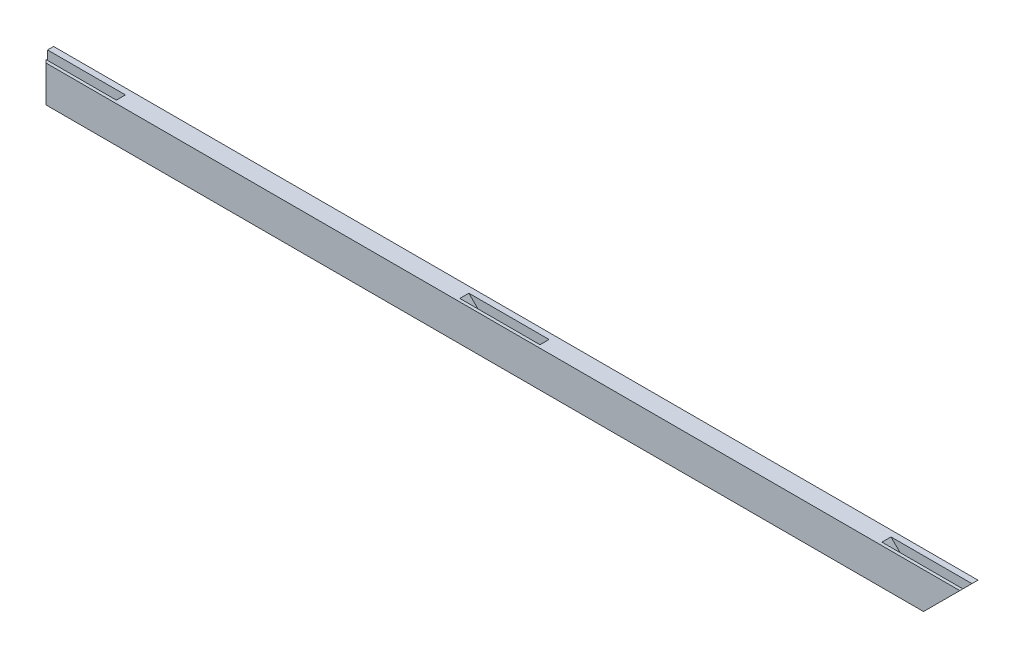
ISO-10303-21;
HEADER;
FILE_DESCRIPTION(('STEP AP214'),'2;1');
FILE_NAME('part.step','',(''),(''),'','','');
FILE_SCHEMA(('AUTOMOTIVE_DESIGN { 1 0 10303 214 1 1 1 1 }'));
ENDSEC;
DATA;
#1=APPLICATION_CONTEXT('core data for automotive mechanical design processes');
#2=APPLICATION_PROTOCOL_DEFINITION('international standard','automotive_design',2000,#1);
#3=PRODUCT_CONTEXT('',#1,'mechanical');
#4=PRODUCT('Part','Part','',(#3));
#5=PRODUCT_RELATED_PRODUCT_CATEGORY('part','',(#4));
#6=PRODUCT_DEFINITION_FORMATION('','',#4);
#7=PRODUCT_DEFINITION_CONTEXT('part definition',#1,'design');
#8=PRODUCT_DEFINITION('design','',#6,#7);
#9=PRODUCT_DEFINITION_SHAPE('','',#8);
#10=(LENGTH_UNIT() NAMED_UNIT(*) SI_UNIT(.MILLI.,.METRE.));
#11=(NAMED_UNIT(*) PLANE_ANGLE_UNIT() SI_UNIT($,.RADIAN.));
#12=(NAMED_UNIT(*) SI_UNIT($,.STERADIAN.) SOLID_ANGLE_UNIT());
#13=UNCERTAINTY_MEASURE_WITH_UNIT(LENGTH_MEASURE(1.E-05),#10,'distance_accuracy_value','');
#14=(GEOMETRIC_REPRESENTATION_CONTEXT(3) GLOBAL_UNCERTAINTY_ASSIGNED_CONTEXT((#13)) GLOBAL_UNIT_ASSIGNED_CONTEXT((#10,
#11,#12)) REPRESENTATION_CONTEXT('',''));
#15=CARTESIAN_POINT('',(0.,0.,0.));
#16=DIRECTION('',(0.,0.,1.));
#17=DIRECTION('',(1.,0.,0.));
#18=AXIS2_PLACEMENT_3D('',#15,#16,#17);
#19=CARTESIAN_POINT('',(611.,12.0000000000005,12.));
#20=DIRECTION('',(0.,-1.,0.));
#21=DIRECTION('',(1.,0.,0.));
#22=AXIS2_PLACEMENT_3D('',#19,#20,#21);
#23=PLANE('',#22);
#24=DIRECTION('',(-1.,0.,0.));
#25=VECTOR('',#24,1.);
#26=CARTESIAN_POINT('',(331.5,12.0000000000005,4.));
#27=LINE('',#26,#25);
#28=CARTESIAN_POINT('',(331.5,12.0000000000005,4.));
#29=VERTEX_POINT('',#28);
#30=CARTESIAN_POINT('',(278.5,12.0000000000005,4.));
#31=VERTEX_POINT('',#30);
#32=EDGE_CURVE('E422',#29,#31,#27,.T.);
#33=ORIENTED_EDGE('',*,*,#32,.F.);
#34=DIRECTION('',(0.,0.,1.));
#35=VECTOR('',#34,1.);
#36=CARTESIAN_POINT('',(331.5,12.0000000000005,4.));
#37=LINE('',#36,#35);
#38=CARTESIAN_POINT('',(331.5,12.0000000000005,10.));
#39=VERTEX_POINT('',#38);
#40=EDGE_CURVE('E454',#29,#39,#37,.T.);
#41=ORIENTED_EDGE('',*,*,#40,.T.);
#42=DIRECTION('',(-1.,0.,0.));
#43=VECTOR('',#42,1.);
#44=CARTESIAN_POINT('',(331.5,12.0000000000005,10.));
#45=LINE('',#44,#43);
#46=CARTESIAN_POINT('',(278.5,12.0000000000003,10.));
#47=VERTEX_POINT('',#46);
#48=EDGE_CURVE('E411',#39,#47,#45,.T.);
#49=ORIENTED_EDGE('',*,*,#48,.T.);
#50=DIRECTION('',(0.,0.,1.));
#51=VECTOR('',#50,1.);
#52=CARTESIAN_POINT('',(278.5,12.0000000000005,4.));
#53=LINE('',#52,#51);
#54=EDGE_CURVE('E439',#31,#47,#53,.T.);
#55=ORIENTED_EDGE('',*,*,#54,.F.);
#56=EDGE_LOOP('',(#33,#41,#49,#55));
#57=FACE_BOUND('',#56,.T.);
#58=DIRECTION('',(-1.,0.,0.));
#59=VECTOR('',#58,1.);
#60=CARTESIAN_POINT('',(51.5,12.0000000000005,4.));
#61=LINE('',#60,#59);
#62=CARTESIAN_POINT('',(51.5,12.0000000000005,4.));
#63=VERTEX_POINT('',#62);
#64=CARTESIAN_POINT('',(0.,12.0000000000001,4.));
#65=VERTEX_POINT('',#64);
#66=EDGE_CURVE('E272',#63,#65,#61,.T.);
#67=ORIENTED_EDGE('',*,*,#66,.F.);
#68=DIRECTION('',(0.,0.,1.));
#69=VECTOR('',#68,1.);
#70=CARTESIAN_POINT('',(51.5,12.0000000000005,4.));
#71=LINE('',#70,#69);
#72=CARTESIAN_POINT('',(51.5,12.0000000000005,10.));
#73=VERTEX_POINT('',#72);
#74=EDGE_CURVE('E283',#63,#73,#71,.T.);
#75=ORIENTED_EDGE('',*,*,#74,.T.);
#76=DIRECTION('',(-1.,0.,0.));
#77=VECTOR('',#76,1.);
#78=CARTESIAN_POINT('',(51.5,12.0000000000005,10.));
#79=LINE('',#78,#77);
#80=CARTESIAN_POINT('',(5.00000000000007,12.0000000000002,10.));
#81=VERTEX_POINT('',#80);
#82=EDGE_CURVE('E288',#73,#81,#79,.T.);
#83=ORIENTED_EDGE('',*,*,#82,.T.);
#84=DIRECTION('',(0.707106781186548,0.,0.707106781186548));
#85=VECTOR('',#84,1.);
#86=CARTESIAN_POINT('',(7.00000000000006,12.0000000000002,12.));
#87=LINE('',#86,#85);
#88=CARTESIAN_POINT('',(7.00000000000012,12.0000000000002,12.));
#89=VERTEX_POINT('',#88);
#90=EDGE_CURVE('E520',#81,#89,#87,.T.);
#91=ORIENTED_EDGE('',*,*,#90,.T.);
#92=DIRECTION('',(-1.,0.,0.));
#93=VECTOR('',#92,1.);
#94=CARTESIAN_POINT('',(611.,12.0000000000005,12.));
#95=LINE('',#94,#93);
#96=CARTESIAN_POINT('',(611.,12.0000000000005,12.));
#97=VERTEX_POINT('',#96);
#98=EDGE_CURVE('E468',#97,#89,#95,.T.);
#99=ORIENTED_EDGE('',*,*,#98,.F.);
#100=DIRECTION('',(0.,0.,-1.));
#101=VECTOR('',#100,1.);
#102=CARTESIAN_POINT('',(611.,12.0000000000005,12.));
#103=LINE('',#102,#101);
#104=CARTESIAN_POINT('',(611.,12.0000000000005,10.));
#105=VERTEX_POINT('',#104);
#106=EDGE_CURVE('E494',#97,#105,#103,.T.);
#107=ORIENTED_EDGE('',*,*,#106,.T.);
#108=DIRECTION('',(-1.,0.,0.));
#109=VECTOR('',#108,1.);
#110=CARTESIAN_POINT('',(557.5,12.0000000000005,10.));
#111=LINE('',#110,#109);
#112=CARTESIAN_POINT('',(557.5,12.0000000000005,10.));
#113=VERTEX_POINT('',#112);
#114=EDGE_CURVE('E63',#105,#113,#111,.T.);
#115=ORIENTED_EDGE('',*,*,#114,.T.);
#116=DIRECTION('',(0.,0.,1.));
#117=VECTOR('',#116,1.);
#118=CARTESIAN_POINT('',(557.5,12.0000000000005,4.));
#119=LINE('',#118,#117);
#120=CARTESIAN_POINT('',(557.5,12.0000000000005,4.));
#121=VERTEX_POINT('',#120);
#122=EDGE_CURVE('E237',#121,#113,#119,.T.);
#123=ORIENTED_EDGE('',*,*,#122,.F.);
#124=DIRECTION('',(-1.,0.,0.));
#125=VECTOR('',#124,1.);
#126=CARTESIAN_POINT('',(557.5,12.0000000000005,4.));
#127=LINE('',#126,#125);
#128=CARTESIAN_POINT('',(611.,12.0000000000005,4.));
#129=VERTEX_POINT('',#128);
#130=EDGE_CURVE('E244',#129,#121,#127,.T.);
#131=ORIENTED_EDGE('',*,*,#130,.F.);
#132=CARTESIAN_POINT('',(611.,12.0000000000005,0.));
#133=VERTEX_POINT('',#132);
#134=EDGE_CURVE('E479',#129,#133,#103,.T.);
#135=ORIENTED_EDGE('',*,*,#134,.T.);
#136=DIRECTION('',(-1.,0.,0.));
#137=VECTOR('',#136,1.);
#138=CARTESIAN_POINT('',(611.,12.0000000000005,0.));
#139=LINE('',#138,#137);
#140=CARTESIAN_POINT('',(0.,12.0000000000001,0.));
#141=VERTEX_POINT('',#140);
#142=EDGE_CURVE('E458',#133,#141,#139,.T.);
#143=ORIENTED_EDGE('',*,*,#142,.T.);
#144=DIRECTION('',(0.,0.,-1.));
#145=VECTOR('',#144,1.);
#146=CARTESIAN_POINT('',(0.,12.0000000000001,12.));
#147=LINE('',#146,#145);
#148=EDGE_CURVE('E505',#65,#141,#147,.T.);
#149=ORIENTED_EDGE('',*,*,#148,.F.);
#150=EDGE_LOOP('',(#67,#75,#83,#91,#99,#107,#115,#123,#131,#135,#143,#149));
#151=FACE_BOUND('',#150,.T.);
#152=ADVANCED_FACE('F39',(#57,#151),#23,.F.);
#153=CARTESIAN_POINT('',(0.,-12.0000000000001,12.));
#154=DIRECTION('',(0.,1.,0.));
#155=DIRECTION('',(0.,0.,1.));
#156=AXIS2_PLACEMENT_3D('',#153,#154,#155);
#157=PLANE('',#156);
#158=DIRECTION('',(0.,0.,1.));
#159=VECTOR('',#158,1.);
#160=CARTESIAN_POINT('',(51.5000000000008,-12.0000000000001,4.));
#161=LINE('',#160,#159);
#162=CARTESIAN_POINT('',(51.5000000000008,-12.0000000000001,4.));
#163=VERTEX_POINT('',#162);
#164=CARTESIAN_POINT('',(51.5000000000008,-12.0000000000001,10.));
#165=VERTEX_POINT('',#164);
#166=EDGE_CURVE('E321',#163,#165,#161,.T.);
#167=ORIENTED_EDGE('',*,*,#166,.F.);
#168=DIRECTION('',(1.,0.,0.));
#169=VECTOR('',#168,1.);
#170=CARTESIAN_POINT('',(51.5000000000008,-12.0000000000001,4.));
#171=LINE('',#170,#169);
#172=CARTESIAN_POINT('',(0.,-12.0000000000001,4.));
#173=VERTEX_POINT('',#172);
#174=EDGE_CURVE('E305',#173,#163,#171,.T.);
#175=ORIENTED_EDGE('',*,*,#174,.F.);
#176=DIRECTION('',(0.,0.,-1.));
#177=VECTOR('',#176,1.);
#178=CARTESIAN_POINT('',(0.,-12.0000000000001,12.));
#179=LINE('',#178,#177);
#180=CARTESIAN_POINT('',(0.,-12.0000000000001,0.));
#181=VERTEX_POINT('',#180);
#182=EDGE_CURVE('E502',#173,#181,#179,.T.);
#183=ORIENTED_EDGE('',*,*,#182,.T.);
#184=DIRECTION('',(1.,0.,0.));
#185=VECTOR('',#184,1.);
#186=CARTESIAN_POINT('',(0.,-12.0000000000001,0.));
#187=LINE('',#186,#185);
#188=CARTESIAN_POINT('',(586.999999999999,-12.0000000000001,0.));
#189=VERTEX_POINT('',#188);
#190=EDGE_CURVE('E487',#181,#189,#187,.T.);
#191=ORIENTED_EDGE('',*,*,#190,.T.);
#192=DIRECTION('',(0.,0.,-1.));
#193=VECTOR('',#192,1.);
#194=CARTESIAN_POINT('',(586.999999999999,-12.0000000000001,12.));
#195=LINE('',#194,#193);
#196=CARTESIAN_POINT('',(586.999999999999,-12.0000000000001,4.));
#197=VERTEX_POINT('',#196);
#198=EDGE_CURVE('E497',#197,#189,#195,.T.);
#199=ORIENTED_EDGE('',*,*,#198,.F.);
#200=DIRECTION('',(1.,0.,0.));
#201=VECTOR('',#200,1.);
#202=CARTESIAN_POINT('',(586.999999999999,-12.0000000000001,4.));
#203=LINE('',#202,#201);
#204=CARTESIAN_POINT('',(557.499999999999,-12.0000000000001,4.));
#205=VERTEX_POINT('',#204);
#206=EDGE_CURVE('E350',#205,#197,#203,.T.);
#207=ORIENTED_EDGE('',*,*,#206,.F.);
#208=DIRECTION('',(0.,0.,1.));
#209=VECTOR('',#208,1.);
#210=CARTESIAN_POINT('',(557.499999999999,-12.0000000000001,4.));
#211=LINE('',#210,#209);
#212=CARTESIAN_POINT('',(557.499999999999,-12.0000000000001,10.));
#213=VERTEX_POINT('',#212);
#214=EDGE_CURVE('E375',#205,#213,#211,.T.);
#215=ORIENTED_EDGE('',*,*,#214,.T.);
#216=DIRECTION('',(1.,0.,0.));
#217=VECTOR('',#216,1.);
#218=CARTESIAN_POINT('',(586.999999999999,-12.0000000000001,10.));
#219=LINE('',#218,#217);
#220=CARTESIAN_POINT('',(586.999999999999,-12.0000000000001,10.));
#221=VERTEX_POINT('',#220);
#222=EDGE_CURVE('E364',#213,#221,#219,.T.);
#223=ORIENTED_EDGE('',*,*,#222,.T.);
#224=CARTESIAN_POINT('',(586.999999999999,-12.0000000000001,12.));
#225=VERTEX_POINT('',#224);
#226=EDGE_CURVE('E498',#225,#221,#195,.T.);
#227=ORIENTED_EDGE('',*,*,#226,.F.);
#228=DIRECTION('',(1.,0.,0.));
#229=VECTOR('',#228,1.);
#230=CARTESIAN_POINT('',(0.,-12.0000000000001,12.));
#231=LINE('',#230,#229);
#232=CARTESIAN_POINT('',(7.00000000000006,-12.0000000000001,12.));
#233=VERTEX_POINT('',#232);
#234=EDGE_CURVE('E472',#233,#225,#231,.T.);
#235=ORIENTED_EDGE('',*,*,#234,.F.);
#236=DIRECTION('',(-0.707106781186548,0.,-0.707106781186548));
#237=VECTOR('',#236,1.);
#238=CARTESIAN_POINT('',(7.00000000000006,-12.0000000000001,12.));
#239=LINE('',#238,#237);
#240=CARTESIAN_POINT('',(5.00000000000006,-12.0000000000001,10.));
#241=VERTEX_POINT('',#240);
#242=EDGE_CURVE('E512',#233,#241,#239,.T.);
#243=ORIENTED_EDGE('',*,*,#242,.T.);
#244=DIRECTION('',(1.,0.,0.));
#245=VECTOR('',#244,1.);
#246=CARTESIAN_POINT('',(51.5000000000008,-12.0000000000001,10.));
#247=LINE('',#246,#245);
#248=EDGE_CURVE('E322',#241,#165,#247,.T.);
#249=ORIENTED_EDGE('',*,*,#248,.T.);
#250=EDGE_LOOP('',(#167,#175,#183,#191,#199,#207,#215,#223,#227,#235,#243,#249));
#251=FACE_BOUND('',#250,.T.);
#252=DIRECTION('',(-1.,0.,0.));
#253=VECTOR('',#252,1.);
#254=CARTESIAN_POINT('',(331.5,-12.0000000000005,4.));
#255=LINE('',#254,#253);
#256=CARTESIAN_POINT('',(331.5,-12.0000000000005,4.));
#257=VERTEX_POINT('',#256);
#258=CARTESIAN_POINT('',(278.5,-12.0000000000005,4.));
#259=VERTEX_POINT('',#258);
#260=EDGE_CURVE('E381',#257,#259,#255,.T.);
#261=ORIENTED_EDGE('',*,*,#260,.T.);
#262=DIRECTION('',(0.,0.,1.));
#263=VECTOR('',#262,1.);
#264=CARTESIAN_POINT('',(278.5,-12.0000000000005,4.));
#265=LINE('',#264,#263);
#266=CARTESIAN_POINT('',(278.5,-12.0000000000005,10.));
#267=VERTEX_POINT('',#266);
#268=EDGE_CURVE('E408',#259,#267,#265,.T.);
#269=ORIENTED_EDGE('',*,*,#268,.T.);
#270=DIRECTION('',(-1.,0.,0.));
#271=VECTOR('',#270,1.);
#272=CARTESIAN_POINT('',(331.5,-12.0000000000005,10.));
#273=LINE('',#272,#271);
#274=CARTESIAN_POINT('',(331.5,-12.0000000000001,10.));
#275=VERTEX_POINT('',#274);
#276=EDGE_CURVE('E374',#275,#267,#273,.T.);
#277=ORIENTED_EDGE('',*,*,#276,.F.);
#278=DIRECTION('',(0.,0.,1.));
#279=VECTOR('',#278,1.);
#280=CARTESIAN_POINT('',(331.5,-12.0000000000005,4.));
#281=LINE('',#280,#279);
#282=EDGE_CURVE('E395',#257,#275,#281,.T.);
#283=ORIENTED_EDGE('',*,*,#282,.F.);
#284=EDGE_LOOP('',(#261,#269,#277,#283));
#285=FACE_BOUND('',#284,.T.);
#286=ADVANCED_FACE('F540',(#251,#285),#157,.F.);
#287=CARTESIAN_POINT('',(0.,12.0000000000001,12.));
#288=DIRECTION('',(1.,0.,0.));
#289=DIRECTION('',(0.,0.,-1.));
#290=AXIS2_PLACEMENT_3D('',#287,#288,#289);
#291=PLANE('',#290);
#292=DIRECTION('',(0.,-1.,0.));
#293=VECTOR('',#292,1.);
#294=CARTESIAN_POINT('',(0.,-12.0000000000001,4.));
#295=LINE('',#294,#293);
#296=CARTESIAN_POINT('',(0.,-5.50000000000015,4.));
#297=VERTEX_POINT('',#296);
#298=EDGE_CURVE('E318',#297,#173,#295,.T.);
#299=ORIENTED_EDGE('',*,*,#298,.F.);
#300=DIRECTION('',(0.,0.,1.));
#301=VECTOR('',#300,1.);
#302=CARTESIAN_POINT('',(0.,-5.50000000000015,4.));
#303=LINE('',#302,#301);
#304=CARTESIAN_POINT('',(0.,-5.50000000000015,4.99999999999994));
#305=VERTEX_POINT('',#304);
#306=EDGE_CURVE('E289',#297,#305,#303,.T.);
#307=ORIENTED_EDGE('',*,*,#306,.T.);
#308=DIRECTION('',(0.,1.,0.));
#309=VECTOR('',#308,1.);
#310=CARTESIAN_POINT('',(0.,12.0000000000001,4.99999999999994));
#311=LINE('',#310,#309);
#312=CARTESIAN_POINT('',(0.,5.50000000000051,4.99999999999994));
#313=VERTEX_POINT('',#312);
#314=EDGE_CURVE('E516',#305,#313,#311,.T.);
#315=ORIENTED_EDGE('',*,*,#314,.T.);
#316=DIRECTION('',(0.,0.,1.));
#317=VECTOR('',#316,1.);
#318=CARTESIAN_POINT('',(0.,5.50000000000051,4.));
#319=LINE('',#318,#317);
#320=CARTESIAN_POINT('',(0.,5.50000000000051,4.));
#321=VERTEX_POINT('',#320);
#322=EDGE_CURVE('E299',#321,#313,#319,.T.);
#323=ORIENTED_EDGE('',*,*,#322,.F.);
#324=DIRECTION('',(0.,-1.,0.));
#325=VECTOR('',#324,1.);
#326=CARTESIAN_POINT('',(0.,12.0000000000001,4.));
#327=LINE('',#326,#325);
#328=EDGE_CURVE('E276',#65,#321,#327,.T.);
#329=ORIENTED_EDGE('',*,*,#328,.F.);
#330=ORIENTED_EDGE('',*,*,#148,.T.);
#331=DIRECTION('',(0.,-1.,0.));
#332=VECTOR('',#331,1.);
#333=CARTESIAN_POINT('',(0.,12.0000000000001,0.));
#334=LINE('',#333,#332);
#335=EDGE_CURVE('E483',#141,#181,#334,.T.);
#336=ORIENTED_EDGE('',*,*,#335,.T.);
#337=ORIENTED_EDGE('',*,*,#182,.F.);
#338=EDGE_LOOP('',(#299,#307,#315,#323,#329,#330,#336,#337));
#339=FACE_BOUND('',#338,.T.);
#340=ADVANCED_FACE('F563',(#339),#291,.F.);
#341=CARTESIAN_POINT('',(586.999999999999,-12.0000000000001,12.));
#342=DIRECTION('',(-0.707106781186547,0.707106781186548,0.));
#343=DIRECTION('',(-0.707106781186548,-0.707106781186547,0.));
#344=AXIS2_PLACEMENT_3D('',#341,#342,#343);
#345=PLANE('',#344);
#346=ORIENTED_EDGE('',*,*,#134,.F.);
#347=DIRECTION('',(0.707106781186545,0.70710678118655,0.));
#348=VECTOR('',#347,1.);
#349=CARTESIAN_POINT('',(611.,12.0000000000005,4.));
#350=LINE('',#349,#348);
#351=CARTESIAN_POINT('',(604.5,5.50000000000052,4.));
#352=VERTEX_POINT('',#351);
#353=EDGE_CURVE('E249',#352,#129,#350,.T.);
#354=ORIENTED_EDGE('',*,*,#353,.F.);
#355=DIRECTION('',(0.,0.,1.));
#356=VECTOR('',#355,1.);
#357=CARTESIAN_POINT('',(604.5,5.50000000000052,4.));
#358=LINE('',#357,#356);
#359=CARTESIAN_POINT('',(604.5,5.50000000000052,10.));
#360=VERTEX_POINT('',#359);
#361=EDGE_CURVE('E262',#352,#360,#358,.T.);
#362=ORIENTED_EDGE('',*,*,#361,.T.);
#363=DIRECTION('',(0.707106781186545,0.70710678118655,0.));
#364=VECTOR('',#363,1.);
#365=CARTESIAN_POINT('',(611.,12.0000000000005,10.));
#366=LINE('',#365,#364);
#367=EDGE_CURVE('E253',#360,#105,#366,.T.);
#368=ORIENTED_EDGE('',*,*,#367,.T.);
#369=ORIENTED_EDGE('',*,*,#106,.F.);
#370=DIRECTION('',(0.707106781186548,0.707106781186547,0.));
#371=VECTOR('',#370,1.);
#372=CARTESIAN_POINT('',(586.999999999999,-12.0000000000001,12.));
#373=LINE('',#372,#371);
#374=EDGE_CURVE('E476',#225,#97,#373,.T.);
#375=ORIENTED_EDGE('',*,*,#374,.F.);
#376=ORIENTED_EDGE('',*,*,#226,.T.);
#377=DIRECTION('',(0.707106781186545,0.70710678118655,0.));
#378=VECTOR('',#377,1.);
#379=CARTESIAN_POINT('',(593.499999999999,-5.50000000000015,10.));
#380=LINE('',#379,#378);
#381=CARTESIAN_POINT('',(593.499999999999,-5.50000000000018,10.));
#382=VERTEX_POINT('',#381);
#383=EDGE_CURVE('E346',#221,#382,#380,.T.);
#384=ORIENTED_EDGE('',*,*,#383,.T.);
#385=DIRECTION('',(0.,0.,1.));
#386=VECTOR('',#385,1.);
#387=CARTESIAN_POINT('',(593.499999999999,-5.50000000000015,4.));
#388=LINE('',#387,#386);
#389=CARTESIAN_POINT('',(593.499999999999,-5.50000000000015,4.));
#390=VERTEX_POINT('',#389);
#391=EDGE_CURVE('E371',#390,#382,#388,.T.);
#392=ORIENTED_EDGE('',*,*,#391,.F.);
#393=DIRECTION('',(0.707106781186545,0.70710678118655,0.));
#394=VECTOR('',#393,1.);
#395=CARTESIAN_POINT('',(593.499999999999,-5.50000000000015,4.));
#396=LINE('',#395,#394);
#397=EDGE_CURVE('E353',#197,#390,#396,.T.);
#398=ORIENTED_EDGE('',*,*,#397,.F.);
#399=ORIENTED_EDGE('',*,*,#198,.T.);
#400=DIRECTION('',(0.707106781186548,0.707106781186547,0.));
#401=VECTOR('',#400,1.);
#402=CARTESIAN_POINT('',(586.999999999999,-12.0000000000001,0.));
#403=LINE('',#402,#401);
#404=EDGE_CURVE('E473',#189,#133,#403,.T.);
#405=ORIENTED_EDGE('',*,*,#404,.T.);
#406=EDGE_LOOP('',(#346,#354,#362,#368,#369,#375,#376,#384,#392,#398,#399,#405));
#407=FACE_BOUND('',#406,.T.);
#408=ADVANCED_FACE('F597',(#407),#345,.F.);
#409=CARTESIAN_POINT('',(0.,0.,12.));
#410=DIRECTION('',(0.,0.,1.));
#411=DIRECTION('',(1.,0.,0.));
#412=AXIS2_PLACEMENT_3D('',#409,#410,#411);
#413=PLANE('',#412);
#414=ORIENTED_EDGE('',*,*,#98,.T.);
#415=DIRECTION('',(0.,-1.,0.));
#416=VECTOR('',#415,1.);
#417=CARTESIAN_POINT('',(7.00000000000006,-12.0000000000001,12.));
#418=LINE('',#417,#416);
#419=EDGE_CURVE('E508',#89,#233,#418,.T.);
#420=ORIENTED_EDGE('',*,*,#419,.T.);
#421=ORIENTED_EDGE('',*,*,#234,.T.);
#422=ORIENTED_EDGE('',*,*,#374,.T.);
#423=EDGE_LOOP('',(#414,#420,#421,#422));
#424=FACE_BOUND('',#423,.T.);
#425=ADVANCED_FACE('F545',(#424),#413,.T.);
#426=CARTESIAN_POINT('',(0.,0.,0.));
#427=DIRECTION('',(0.,0.,1.));
#428=DIRECTION('',(1.,0.,0.));
#429=AXIS2_PLACEMENT_3D('',#426,#427,#428);
#430=PLANE('',#429);
#431=ORIENTED_EDGE('',*,*,#142,.F.);
#432=ORIENTED_EDGE('',*,*,#404,.F.);
#433=ORIENTED_EDGE('',*,*,#190,.F.);
#434=ORIENTED_EDGE('',*,*,#335,.F.);
#435=EDGE_LOOP('',(#431,#432,#433,#434));
#436=FACE_BOUND('',#435,.T.);
#437=ADVANCED_FACE('F602',(#436),#430,.F.);
#438=CARTESIAN_POINT('',(325.,5.50000000000052,4.));
#439=DIRECTION('',(0.707106781186547,-0.707106781186548,0.));
#440=DIRECTION('',(0.707106781186548,0.707106781186547,0.));
#441=AXIS2_PLACEMENT_3D('',#438,#439,#440);
#442=PLANE('',#441);
#443=DIRECTION('',(0.707106781186548,0.707106781186547,0.));
#444=VECTOR('',#443,1.);
#445=CARTESIAN_POINT('',(325.,5.50000000000052,10.));
#446=LINE('',#445,#444);
#447=CARTESIAN_POINT('',(325.,5.50000000000052,10.));
#448=VERTEX_POINT('',#447);
#449=EDGE_CURVE('E427',#448,#39,#446,.T.);
#450=ORIENTED_EDGE('',*,*,#449,.T.);
#451=ORIENTED_EDGE('',*,*,#40,.F.);
#452=DIRECTION('',(0.707106781186548,0.707106781186547,0.));
#453=VECTOR('',#452,1.);
#454=CARTESIAN_POINT('',(325.,5.50000000000052,4.));
#455=LINE('',#454,#453);
#456=CARTESIAN_POINT('',(325.,5.50000000000052,4.));
#457=VERTEX_POINT('',#456);
#458=EDGE_CURVE('E435',#457,#29,#455,.T.);
#459=ORIENTED_EDGE('',*,*,#458,.F.);
#460=DIRECTION('',(0.,0.,1.));
#461=VECTOR('',#460,1.);
#462=CARTESIAN_POINT('',(325.,5.50000000000052,4.));
#463=LINE('',#462,#461);
#464=EDGE_CURVE('E459',#457,#448,#463,.T.);
#465=ORIENTED_EDGE('',*,*,#464,.T.);
#466=EDGE_LOOP('',(#450,#451,#459,#465));
#467=FACE_BOUND('',#466,.T.);
#468=ADVANCED_FACE('F605',(#467),#442,.F.);
#469=CARTESIAN_POINT('',(285.,5.50000000000051,4.));
#470=DIRECTION('',(0.,-1.,0.));
#471=DIRECTION('',(1.,0.,0.));
#472=AXIS2_PLACEMENT_3D('',#469,#470,#471);
#473=PLANE('',#472);
#474=DIRECTION('',(1.,0.,0.));
#475=VECTOR('',#474,1.);
#476=CARTESIAN_POINT('',(285.,5.50000000000051,10.));
#477=LINE('',#476,#475);
#478=CARTESIAN_POINT('',(285.,5.50000000000051,10.));
#479=VERTEX_POINT('',#478);
#480=EDGE_CURVE('E447',#479,#448,#477,.T.);
#481=ORIENTED_EDGE('',*,*,#480,.T.);
#482=ORIENTED_EDGE('',*,*,#464,.F.);
#483=DIRECTION('',(1.,0.,0.));
#484=VECTOR('',#483,1.);
#485=CARTESIAN_POINT('',(285.,5.50000000000051,4.));
#486=LINE('',#485,#484);
#487=CARTESIAN_POINT('',(285.,5.50000000000051,4.));
#488=VERTEX_POINT('',#487);
#489=EDGE_CURVE('E431',#488,#457,#486,.T.);
#490=ORIENTED_EDGE('',*,*,#489,.F.);
#491=DIRECTION('',(0.,0.,1.));
#492=VECTOR('',#491,1.);
#493=CARTESIAN_POINT('',(285.,5.50000000000051,4.));
#494=LINE('',#493,#492);
#495=EDGE_CURVE('E462',#488,#479,#494,.T.);
#496=ORIENTED_EDGE('',*,*,#495,.T.);
#497=EDGE_LOOP('',(#481,#482,#490,#496));
#498=FACE_BOUND('',#497,.T.);
#499=ADVANCED_FACE('F613',(#498),#473,.F.);
#500=CARTESIAN_POINT('',(278.5,12.0000000000005,4.));
#501=DIRECTION('',(-0.70710678118655,-0.707106781186544,0.));
#502=DIRECTION('',(0.707106781186545,-0.707106781186551,0.));
#503=AXIS2_PLACEMENT_3D('',#500,#501,#502);
#504=PLANE('',#503);
#505=DIRECTION('',(0.707106781186545,-0.707106781186551,0.));
#506=VECTOR('',#505,1.);
#507=CARTESIAN_POINT('',(278.5,12.0000000000005,10.));
#508=LINE('',#507,#506);
#509=EDGE_CURVE('E443',#47,#479,#508,.T.);
#510=ORIENTED_EDGE('',*,*,#509,.T.);
#511=ORIENTED_EDGE('',*,*,#495,.F.);
#512=DIRECTION('',(0.707106781186545,-0.707106781186551,0.));
#513=VECTOR('',#512,1.);
#514=CARTESIAN_POINT('',(278.5,12.0000000000005,4.));
#515=LINE('',#514,#513);
#516=EDGE_CURVE('E426',#31,#488,#515,.T.);
#517=ORIENTED_EDGE('',*,*,#516,.F.);
#518=ORIENTED_EDGE('',*,*,#54,.T.);
#519=EDGE_LOOP('',(#510,#511,#517,#518));
#520=FACE_BOUND('',#519,.T.);
#521=ADVANCED_FACE('F609',(#520),#504,.F.);
#522=CARTESIAN_POINT('',(0.,0.,4.));
#523=DIRECTION('',(0.,0.,1.));
#524=DIRECTION('',(1.,0.,0.));
#525=AXIS2_PLACEMENT_3D('',#522,#523,#524);
#526=PLANE('',#525);
#527=ORIENTED_EDGE('',*,*,#32,.T.);
#528=ORIENTED_EDGE('',*,*,#516,.T.);
#529=ORIENTED_EDGE('',*,*,#489,.T.);
#530=ORIENTED_EDGE('',*,*,#458,.T.);
#531=EDGE_LOOP('',(#527,#528,#529,#530));
#532=FACE_BOUND('',#531,.T.);
#533=ADVANCED_FACE('F612',(#532),#526,.T.);
#534=CARTESIAN_POINT('',(0.,0.,10.));
#535=DIRECTION('',(0.,0.,1.));
#536=DIRECTION('',(1.,0.,0.));
#537=AXIS2_PLACEMENT_3D('',#534,#535,#536);
#538=PLANE('',#537);
#539=ORIENTED_EDGE('',*,*,#48,.F.);
#540=ORIENTED_EDGE('',*,*,#449,.F.);
#541=ORIENTED_EDGE('',*,*,#480,.F.);
#542=ORIENTED_EDGE('',*,*,#509,.F.);
#543=EDGE_LOOP('',(#539,#540,#541,#542));
#544=FACE_BOUND('',#543,.T.);
#545=ADVANCED_FACE('F621',(#544),#538,.F.);
#546=CARTESIAN_POINT('',(7.00000000000006,0.,12.));
#547=DIRECTION('',(-0.707106781186547,0.,0.707106781186547));
#548=DIRECTION('',(0.,1.,0.));
#549=AXIS2_PLACEMENT_3D('',#546,#547,#548);
#550=PLANE('',#549);
#551=DIRECTION('',(-0.707106781186548,0.,-0.707106781186548));
#552=VECTOR('',#551,1.);
#553=CARTESIAN_POINT('',(7.00000000000006,-5.50000000000015,12.));
#554=LINE('',#553,#552);
#555=CARTESIAN_POINT('',(5.00000000000006,-5.50000000000015,10.));
#556=VERTEX_POINT('',#555);
#557=EDGE_CURVE('E11',#556,#305,#554,.T.);
#558=ORIENTED_EDGE('',*,*,#557,.F.);
#559=DIRECTION('',(0.,-1.,0.));
#560=VECTOR('',#559,1.);
#561=CARTESIAN_POINT('',(5.00000000000006,0.,10.));
#562=LINE('',#561,#560);
#563=EDGE_CURVE('E48',#556,#241,#562,.T.);
#564=ORIENTED_EDGE('',*,*,#563,.T.);
#565=ORIENTED_EDGE('',*,*,#242,.F.);
#566=ORIENTED_EDGE('',*,*,#419,.F.);
#567=ORIENTED_EDGE('',*,*,#90,.F.);
#568=DIRECTION('',(0.,1.,0.));
#569=VECTOR('',#568,1.);
#570=CARTESIAN_POINT('',(5.00000000000006,0.,10.));
#571=LINE('',#570,#569);
#572=CARTESIAN_POINT('',(5.00000000000006,5.50000000000051,10.));
#573=VERTEX_POINT('',#572);
#574=EDGE_CURVE('E523',#573,#81,#571,.T.);
#575=ORIENTED_EDGE('',*,*,#574,.F.);
#576=DIRECTION('',(0.707106781186548,0.,0.707106781186548));
#577=VECTOR('',#576,1.);
#578=CARTESIAN_POINT('',(7.00000000000006,5.50000000000051,12.));
#579=LINE('',#578,#577);
#580=EDGE_CURVE('E526',#313,#573,#579,.T.);
#581=ORIENTED_EDGE('',*,*,#580,.F.);
#582=ORIENTED_EDGE('',*,*,#314,.F.);
#583=EDGE_LOOP('',(#558,#564,#565,#566,#567,#575,#581,#582));
#584=FACE_BOUND('',#583,.T.);
#585=ADVANCED_FACE('F41',(#584),#550,.T.);
#586=CARTESIAN_POINT('',(278.5,-12.0000000000005,4.));
#587=DIRECTION('',(0.70710678118655,-0.707106781186544,0.));
#588=DIRECTION('',(0.707106781186545,0.707106781186551,0.));
#589=AXIS2_PLACEMENT_3D('',#586,#587,#588);
#590=PLANE('',#589);
#591=DIRECTION('',(0.707106781186545,0.707106781186551,0.));
#592=VECTOR('',#591,1.);
#593=CARTESIAN_POINT('',(278.5,-12.0000000000005,10.));
#594=LINE('',#593,#592);
#595=CARTESIAN_POINT('',(285.,-5.50000000000051,10.));
#596=VERTEX_POINT('',#595);
#597=EDGE_CURVE('E386',#267,#596,#594,.T.);
#598=ORIENTED_EDGE('',*,*,#597,.F.);
#599=ORIENTED_EDGE('',*,*,#268,.F.);
#600=DIRECTION('',(0.707106781186545,0.707106781186551,0.));
#601=VECTOR('',#600,1.);
#602=CARTESIAN_POINT('',(278.5,-12.0000000000005,4.));
#603=LINE('',#602,#601);
#604=CARTESIAN_POINT('',(285.,-5.50000000000051,4.));
#605=VERTEX_POINT('',#604);
#606=EDGE_CURVE('E392',#259,#605,#603,.T.);
#607=ORIENTED_EDGE('',*,*,#606,.T.);
#608=DIRECTION('',(0.,0.,1.));
#609=VECTOR('',#608,1.);
#610=CARTESIAN_POINT('',(285.,-5.50000000000051,4.));
#611=LINE('',#610,#609);
#612=EDGE_CURVE('E412',#605,#596,#611,.T.);
#613=ORIENTED_EDGE('',*,*,#612,.T.);
#614=EDGE_LOOP('',(#598,#599,#607,#613));
#615=FACE_BOUND('',#614,.T.);
#616=ADVANCED_FACE('F636',(#615),#590,.T.);
#617=CARTESIAN_POINT('',(285.,-5.50000000000051,4.));
#618=DIRECTION('',(0.,-1.,0.));
#619=DIRECTION('',(1.,0.,0.));
#620=AXIS2_PLACEMENT_3D('',#617,#618,#619);
#621=PLANE('',#620);
#622=DIRECTION('',(1.,0.,0.));
#623=VECTOR('',#622,1.);
#624=CARTESIAN_POINT('',(285.,-5.50000000000051,10.));
#625=LINE('',#624,#623);
#626=CARTESIAN_POINT('',(325.,-5.50000000000052,10.));
#627=VERTEX_POINT('',#626);
#628=EDGE_CURVE('E403',#596,#627,#625,.T.);
#629=ORIENTED_EDGE('',*,*,#628,.F.);
#630=ORIENTED_EDGE('',*,*,#612,.F.);
#631=DIRECTION('',(1.,0.,0.));
#632=VECTOR('',#631,1.);
#633=CARTESIAN_POINT('',(285.,-5.50000000000051,4.));
#634=LINE('',#633,#632);
#635=CARTESIAN_POINT('',(325.,-5.50000000000052,4.));
#636=VERTEX_POINT('',#635);
#637=EDGE_CURVE('E389',#605,#636,#634,.T.);
#638=ORIENTED_EDGE('',*,*,#637,.T.);
#639=DIRECTION('',(0.,0.,1.));
#640=VECTOR('',#639,1.);
#641=CARTESIAN_POINT('',(325.,-5.50000000000052,4.));
#642=LINE('',#641,#640);
#643=EDGE_CURVE('E416',#636,#627,#642,.T.);
#644=ORIENTED_EDGE('',*,*,#643,.T.);
#645=EDGE_LOOP('',(#629,#630,#638,#644));
#646=FACE_BOUND('',#645,.T.);
#647=ADVANCED_FACE('F632',(#646),#621,.T.);
#648=CARTESIAN_POINT('',(325.,-5.50000000000052,4.));
#649=DIRECTION('',(-0.707106781186547,-0.707106781186548,0.));
#650=DIRECTION('',(0.707106781186548,-0.707106781186547,0.));
#651=AXIS2_PLACEMENT_3D('',#648,#649,#650);
#652=PLANE('',#651);
#653=DIRECTION('',(0.707106781186548,-0.707106781186547,0.));
#654=VECTOR('',#653,1.);
#655=CARTESIAN_POINT('',(325.,-5.50000000000052,10.));
#656=LINE('',#655,#654);
#657=EDGE_CURVE('E399',#627,#275,#656,.T.);
#658=ORIENTED_EDGE('',*,*,#657,.F.);
#659=ORIENTED_EDGE('',*,*,#643,.F.);
#660=DIRECTION('',(0.707106781186548,-0.707106781186547,0.));
#661=VECTOR('',#660,1.);
#662=CARTESIAN_POINT('',(325.,-5.50000000000052,4.));
#663=LINE('',#662,#661);
#664=EDGE_CURVE('E385',#636,#257,#663,.T.);
#665=ORIENTED_EDGE('',*,*,#664,.T.);
#666=ORIENTED_EDGE('',*,*,#282,.T.);
#667=EDGE_LOOP('',(#658,#659,#665,#666));
#668=FACE_BOUND('',#667,.T.);
#669=ADVANCED_FACE('F628',(#668),#652,.T.);
#670=CARTESIAN_POINT('',(0.,0.,4.));
#671=DIRECTION('',(0.,0.,1.));
#672=DIRECTION('',(1.,0.,0.));
#673=AXIS2_PLACEMENT_3D('',#670,#671,#672);
#674=PLANE('',#673);
#675=ORIENTED_EDGE('',*,*,#260,.F.);
#676=ORIENTED_EDGE('',*,*,#664,.F.);
#677=ORIENTED_EDGE('',*,*,#637,.F.);
#678=ORIENTED_EDGE('',*,*,#606,.F.);
#679=EDGE_LOOP('',(#675,#676,#677,#678));
#680=FACE_BOUND('',#679,.T.);
#681=ADVANCED_FACE('F631',(#680),#674,.T.);
#682=CARTESIAN_POINT('',(0.,0.,10.));
#683=DIRECTION('',(0.,0.,1.));
#684=DIRECTION('',(1.,0.,0.));
#685=AXIS2_PLACEMENT_3D('',#682,#683,#684);
#686=PLANE('',#685);
#687=ORIENTED_EDGE('',*,*,#276,.T.);
#688=ORIENTED_EDGE('',*,*,#597,.T.);
#689=ORIENTED_EDGE('',*,*,#628,.T.);
#690=ORIENTED_EDGE('',*,*,#657,.T.);
#691=EDGE_LOOP('',(#687,#688,#689,#690));
#692=FACE_BOUND('',#691,.T.);
#693=ADVANCED_FACE('F641',(#692),#686,.F.);
#694=CARTESIAN_POINT('',(45.,5.50000000000051,4.));
#695=DIRECTION('',(0.707106781186548,-0.707106781186547,0.));
#696=DIRECTION('',(0.707106781186547,0.707106781186548,0.));
#697=AXIS2_PLACEMENT_3D('',#694,#695,#696);
#698=PLANE('',#697);
#699=DIRECTION('',(0.707106781186547,0.707106781186548,0.));
#700=VECTOR('',#699,1.);
#701=CARTESIAN_POINT('',(45.,5.50000000000051,10.));
#702=LINE('',#701,#700);
#703=CARTESIAN_POINT('',(45.,5.50000000000051,10.));
#704=VERTEX_POINT('',#703);
#705=EDGE_CURVE('E284',#704,#73,#702,.T.);
#706=ORIENTED_EDGE('',*,*,#705,.T.);
#707=ORIENTED_EDGE('',*,*,#74,.F.);
#708=DIRECTION('',(0.707106781186547,0.707106781186548,0.));
#709=VECTOR('',#708,1.);
#710=CARTESIAN_POINT('',(45.,5.50000000000051,4.));
#711=LINE('',#710,#709);
#712=CARTESIAN_POINT('',(45.,5.50000000000051,4.));
#713=VERTEX_POINT('',#712);
#714=EDGE_CURVE('E268',#713,#63,#711,.T.);
#715=ORIENTED_EDGE('',*,*,#714,.F.);
#716=DIRECTION('',(0.,0.,1.));
#717=VECTOR('',#716,1.);
#718=CARTESIAN_POINT('',(45.,5.50000000000051,4.));
#719=LINE('',#718,#717);
#720=EDGE_CURVE('E295',#713,#704,#719,.T.);
#721=ORIENTED_EDGE('',*,*,#720,.T.);
#722=EDGE_LOOP('',(#706,#707,#715,#721));
#723=FACE_BOUND('',#722,.T.);
#724=ADVANCED_FACE('F555',(#723),#698,.F.);
#725=CARTESIAN_POINT('',(0.,5.50000000000051,4.));
#726=DIRECTION('',(0.,-1.,0.));
#727=DIRECTION('',(1.,0.,0.));
#728=AXIS2_PLACEMENT_3D('',#725,#726,#727);
#729=PLANE('',#728);
#730=ORIENTED_EDGE('',*,*,#580,.T.);
#731=DIRECTION('',(1.,0.,0.));
#732=VECTOR('',#731,1.);
#733=CARTESIAN_POINT('',(0.,5.50000000000051,10.));
#734=LINE('',#733,#732);
#735=EDGE_CURVE('E273',#573,#704,#734,.T.);
#736=ORIENTED_EDGE('',*,*,#735,.T.);
#737=ORIENTED_EDGE('',*,*,#720,.F.);
#738=DIRECTION('',(1.,0.,0.));
#739=VECTOR('',#738,1.);
#740=CARTESIAN_POINT('',(0.,5.50000000000051,4.));
#741=LINE('',#740,#739);
#742=EDGE_CURVE('E279',#321,#713,#741,.T.);
#743=ORIENTED_EDGE('',*,*,#742,.F.);
#744=ORIENTED_EDGE('',*,*,#322,.T.);
#745=EDGE_LOOP('',(#730,#736,#737,#743,#744));
#746=FACE_BOUND('',#745,.T.);
#747=ADVANCED_FACE('F559',(#746),#729,.F.);
#748=CARTESIAN_POINT('',(0.,0.,4.));
#749=DIRECTION('',(0.,0.,1.));
#750=DIRECTION('',(1.,0.,0.));
#751=AXIS2_PLACEMENT_3D('',#748,#749,#750);
#752=PLANE('',#751);
#753=ORIENTED_EDGE('',*,*,#714,.T.);
#754=ORIENTED_EDGE('',*,*,#66,.T.);
#755=ORIENTED_EDGE('',*,*,#328,.T.);
#756=ORIENTED_EDGE('',*,*,#742,.T.);
#757=EDGE_LOOP('',(#753,#754,#755,#756));
#758=FACE_BOUND('',#757,.T.);
#759=ADVANCED_FACE('F664',(#758),#752,.T.);
#760=CARTESIAN_POINT('',(0.,0.,10.));
#761=DIRECTION('',(0.,0.,1.));
#762=DIRECTION('',(1.,0.,0.));
#763=AXIS2_PLACEMENT_3D('',#760,#761,#762);
#764=PLANE('',#763);
#765=ORIENTED_EDGE('',*,*,#574,.T.);
#766=ORIENTED_EDGE('',*,*,#82,.F.);
#767=ORIENTED_EDGE('',*,*,#705,.F.);
#768=ORIENTED_EDGE('',*,*,#735,.F.);
#769=EDGE_LOOP('',(#765,#766,#767,#768));
#770=FACE_BOUND('',#769,.T.);
#771=ADVANCED_FACE('F553',(#770),#764,.F.);
#772=CARTESIAN_POINT('',(0.,-5.50000000000015,4.));
#773=DIRECTION('',(0.,1.,0.));
#774=DIRECTION('',(-1.,0.,0.));
#775=AXIS2_PLACEMENT_3D('',#772,#773,#774);
#776=PLANE('',#775);
#777=ORIENTED_EDGE('',*,*,#557,.T.);
#778=ORIENTED_EDGE('',*,*,#306,.F.);
#779=DIRECTION('',(-1.,0.,0.));
#780=VECTOR('',#779,1.);
#781=CARTESIAN_POINT('',(0.,-5.50000000000015,4.));
#782=LINE('',#781,#780);
#783=CARTESIAN_POINT('',(45.,-5.50000000000015,4.));
#784=VERTEX_POINT('',#783);
#785=EDGE_CURVE('E314',#784,#297,#782,.T.);
#786=ORIENTED_EDGE('',*,*,#785,.F.);
#787=DIRECTION('',(0.,0.,1.));
#788=VECTOR('',#787,1.);
#789=CARTESIAN_POINT('',(45.,-5.50000000000015,4.));
#790=LINE('',#789,#788);
#791=CARTESIAN_POINT('',(45.,-5.50000000000015,10.));
#792=VERTEX_POINT('',#791);
#793=EDGE_CURVE('E336',#784,#792,#790,.T.);
#794=ORIENTED_EDGE('',*,*,#793,.T.);
#795=DIRECTION('',(-1.,0.,0.));
#796=VECTOR('',#795,1.);
#797=CARTESIAN_POINT('',(0.,-5.50000000000015,10.));
#798=LINE('',#797,#796);
#799=EDGE_CURVE('E310',#792,#556,#798,.T.);
#800=ORIENTED_EDGE('',*,*,#799,.T.);
#801=EDGE_LOOP('',(#777,#778,#786,#794,#800));
#802=FACE_BOUND('',#801,.T.);
#803=ADVANCED_FACE('F568',(#802),#776,.F.);
#804=CARTESIAN_POINT('',(45.,-5.50000000000015,4.));
#805=DIRECTION('',(0.707106781186505,0.70710678118659,0.));
#806=DIRECTION('',(-0.70710678118659,0.707106781186505,0.));
#807=AXIS2_PLACEMENT_3D('',#804,#805,#806);
#808=PLANE('',#807);
#809=DIRECTION('',(-0.70710678118659,0.707106781186505,0.));
#810=VECTOR('',#809,1.);
#811=CARTESIAN_POINT('',(45.,-5.50000000000015,10.));
#812=LINE('',#811,#810);
#813=EDGE_CURVE('E326',#165,#792,#812,.T.);
#814=ORIENTED_EDGE('',*,*,#813,.T.);
#815=ORIENTED_EDGE('',*,*,#793,.F.);
#816=DIRECTION('',(-0.70710678118659,0.707106781186505,0.));
#817=VECTOR('',#816,1.);
#818=CARTESIAN_POINT('',(45.,-5.50000000000015,4.));
#819=LINE('',#818,#817);
#820=EDGE_CURVE('E309',#163,#784,#819,.T.);
#821=ORIENTED_EDGE('',*,*,#820,.F.);
#822=ORIENTED_EDGE('',*,*,#166,.T.);
#823=EDGE_LOOP('',(#814,#815,#821,#822));
#824=FACE_BOUND('',#823,.T.);
#825=ADVANCED_FACE('F573',(#824),#808,.F.);
#826=CARTESIAN_POINT('',(0.,0.,4.));
#827=DIRECTION('',(0.,0.,-1.));
#828=DIRECTION('',(-1.,0.,0.));
#829=AXIS2_PLACEMENT_3D('',#826,#827,#828);
#830=PLANE('',#829);
#831=ORIENTED_EDGE('',*,*,#174,.T.);
#832=ORIENTED_EDGE('',*,*,#820,.T.);
#833=ORIENTED_EDGE('',*,*,#785,.T.);
#834=ORIENTED_EDGE('',*,*,#298,.T.);
#835=EDGE_LOOP('',(#831,#832,#833,#834));
#836=FACE_BOUND('',#835,.T.);
#837=ADVANCED_FACE('F570',(#836),#830,.F.);
#838=CARTESIAN_POINT('',(0.,0.,10.));
#839=DIRECTION('',(0.,0.,-1.));
#840=DIRECTION('',(-1.,0.,0.));
#841=AXIS2_PLACEMENT_3D('',#838,#839,#840);
#842=PLANE('',#841);
#843=ORIENTED_EDGE('',*,*,#799,.F.);
#844=ORIENTED_EDGE('',*,*,#813,.F.);
#845=ORIENTED_EDGE('',*,*,#248,.F.);
#846=ORIENTED_EDGE('',*,*,#563,.F.);
#847=EDGE_LOOP('',(#843,#844,#845,#846));
#848=FACE_BOUND('',#847,.T.);
#849=ADVANCED_FACE('F575',(#848),#842,.T.);
#850=CARTESIAN_POINT('',(563.999999999999,-5.50000000000015,4.));
#851=DIRECTION('',(0.,1.,0.));
#852=DIRECTION('',(-1.,0.,0.));
#853=AXIS2_PLACEMENT_3D('',#850,#851,#852);
#854=PLANE('',#853);
#855=DIRECTION('',(-1.,0.,0.));
#856=VECTOR('',#855,1.);
#857=CARTESIAN_POINT('',(563.999999999999,-5.50000000000015,10.));
#858=LINE('',#857,#856);
#859=CARTESIAN_POINT('',(563.999999999999,-5.50000000000015,10.));
#860=VERTEX_POINT('',#859);
#861=EDGE_CURVE('E55',#382,#860,#858,.T.);
#862=ORIENTED_EDGE('',*,*,#861,.T.);
#863=DIRECTION('',(0.,0.,1.));
#864=VECTOR('',#863,1.);
#865=CARTESIAN_POINT('',(563.999999999999,-5.50000000000015,4.));
#866=LINE('',#865,#864);
#867=CARTESIAN_POINT('',(563.999999999999,-5.50000000000015,4.));
#868=VERTEX_POINT('',#867);
#869=EDGE_CURVE('E357',#868,#860,#866,.T.);
#870=ORIENTED_EDGE('',*,*,#869,.F.);
#871=DIRECTION('',(-1.,0.,0.));
#872=VECTOR('',#871,1.);
#873=CARTESIAN_POINT('',(563.999999999999,-5.50000000000015,4.));
#874=LINE('',#873,#872);
#875=EDGE_CURVE('E341',#390,#868,#874,.T.);
#876=ORIENTED_EDGE('',*,*,#875,.F.);
#877=ORIENTED_EDGE('',*,*,#391,.T.);
#878=EDGE_LOOP('',(#862,#870,#876,#877));
#879=FACE_BOUND('',#878,.T.);
#880=ADVANCED_FACE('F577',(#879),#854,.F.);
#881=CARTESIAN_POINT('',(557.499999999999,-12.0000000000001,4.));
#882=DIRECTION('',(-0.707106781186556,0.707106781186539,0.));
#883=DIRECTION('',(-0.707106781186539,-0.707106781186556,0.));
#884=AXIS2_PLACEMENT_3D('',#881,#882,#883);
#885=PLANE('',#884);
#886=DIRECTION('',(-0.707106781186539,-0.707106781186556,0.));
#887=VECTOR('',#886,1.);
#888=CARTESIAN_POINT('',(557.499999999999,-12.0000000000001,10.));
#889=LINE('',#888,#887);
#890=EDGE_CURVE('E360',#860,#213,#889,.T.);
#891=ORIENTED_EDGE('',*,*,#890,.T.);
#892=ORIENTED_EDGE('',*,*,#214,.F.);
#893=DIRECTION('',(-0.707106781186539,-0.707106781186556,0.));
#894=VECTOR('',#893,1.);
#895=CARTESIAN_POINT('',(557.499999999999,-12.0000000000001,4.));
#896=LINE('',#895,#894);
#897=EDGE_CURVE('E345',#868,#205,#896,.T.);
#898=ORIENTED_EDGE('',*,*,#897,.F.);
#899=ORIENTED_EDGE('',*,*,#869,.T.);
#900=EDGE_LOOP('',(#891,#892,#898,#899));
#901=FACE_BOUND('',#900,.T.);
#902=ADVANCED_FACE('F583',(#901),#885,.F.);
#903=CARTESIAN_POINT('',(0.,0.,4.));
#904=DIRECTION('',(0.,0.,-1.));
#905=DIRECTION('',(-1.,0.,0.));
#906=AXIS2_PLACEMENT_3D('',#903,#904,#905);
#907=PLANE('',#906);
#908=ORIENTED_EDGE('',*,*,#875,.T.);
#909=ORIENTED_EDGE('',*,*,#897,.T.);
#910=ORIENTED_EDGE('',*,*,#206,.T.);
#911=ORIENTED_EDGE('',*,*,#397,.T.);
#912=EDGE_LOOP('',(#908,#909,#910,#911));
#913=FACE_BOUND('',#912,.T.);
#914=ADVANCED_FACE('F650',(#913),#907,.F.);
#915=CARTESIAN_POINT('',(0.,0.,10.));
#916=DIRECTION('',(0.,0.,-1.));
#917=DIRECTION('',(-1.,0.,0.));
#918=AXIS2_PLACEMENT_3D('',#915,#916,#917);
#919=PLANE('',#918);
#920=ORIENTED_EDGE('',*,*,#861,.F.);
#921=ORIENTED_EDGE('',*,*,#383,.F.);
#922=ORIENTED_EDGE('',*,*,#222,.F.);
#923=ORIENTED_EDGE('',*,*,#890,.F.);
#924=EDGE_LOOP('',(#920,#921,#922,#923));
#925=FACE_BOUND('',#924,.T.);
#926=ADVANCED_FACE('F652',(#925),#919,.T.);
#927=CARTESIAN_POINT('',(604.5,5.50000000000052,4.));
#928=DIRECTION('',(0.,-1.,0.));
#929=DIRECTION('',(1.,0.,0.));
#930=AXIS2_PLACEMENT_3D('',#927,#928,#929);
#931=PLANE('',#930);
#932=DIRECTION('',(1.,0.,0.));
#933=VECTOR('',#932,1.);
#934=CARTESIAN_POINT('',(604.5,5.50000000000052,10.));
#935=LINE('',#934,#933);
#936=CARTESIAN_POINT('',(564.,5.50000000000051,10.));
#937=VERTEX_POINT('',#936);
#938=EDGE_CURVE('E910',#937,#360,#935,.T.);
#939=ORIENTED_EDGE('',*,*,#938,.T.);
#940=ORIENTED_EDGE('',*,*,#361,.F.);
#941=DIRECTION('',(1.,0.,0.));
#942=VECTOR('',#941,1.);
#943=CARTESIAN_POINT('',(604.5,5.50000000000052,4.));
#944=LINE('',#943,#942);
#945=CARTESIAN_POINT('',(564.,5.50000000000051,4.));
#946=VERTEX_POINT('',#945);
#947=EDGE_CURVE('E243',#946,#352,#944,.T.);
#948=ORIENTED_EDGE('',*,*,#947,.F.);
#949=DIRECTION('',(0.,0.,1.));
#950=VECTOR('',#949,1.);
#951=CARTESIAN_POINT('',(564.,5.50000000000051,4.));
#952=LINE('',#951,#950);
#953=EDGE_CURVE('E238',#946,#937,#952,.T.);
#954=ORIENTED_EDGE('',*,*,#953,.T.);
#955=EDGE_LOOP('',(#939,#940,#948,#954));
#956=FACE_BOUND('',#955,.T.);
#957=ADVANCED_FACE('F655',(#956),#931,.F.);
#958=CARTESIAN_POINT('',(564.,5.50000000000051,4.));
#959=DIRECTION('',(-0.70710678118655,-0.707106781186544,0.));
#960=DIRECTION('',(0.707106781186545,-0.70710678118655,0.));
#961=AXIS2_PLACEMENT_3D('',#958,#959,#960);
#962=PLANE('',#961);
#963=DIRECTION('',(0.707106781186545,-0.70710678118655,0.));
#964=VECTOR('',#963,1.);
#965=CARTESIAN_POINT('',(564.,5.50000000000051,10.));
#966=LINE('',#965,#964);
#967=EDGE_CURVE('E912',#113,#937,#966,.T.);
#968=ORIENTED_EDGE('',*,*,#967,.T.);
#969=ORIENTED_EDGE('',*,*,#953,.F.);
#970=DIRECTION('',(0.707106781186545,-0.70710678118655,0.));
#971=VECTOR('',#970,1.);
#972=CARTESIAN_POINT('',(564.,5.50000000000051,4.));
#973=LINE('',#972,#971);
#974=EDGE_CURVE('E232',#121,#946,#973,.T.);
#975=ORIENTED_EDGE('',*,*,#974,.F.);
#976=ORIENTED_EDGE('',*,*,#122,.T.);
#977=EDGE_LOOP('',(#968,#969,#975,#976));
#978=FACE_BOUND('',#977,.T.);
#979=ADVANCED_FACE('F235',(#978),#962,.F.);
#980=CARTESIAN_POINT('',(0.,0.,4.));
#981=DIRECTION('',(0.,0.,-1.));
#982=DIRECTION('',(-1.,0.,0.));
#983=AXIS2_PLACEMENT_3D('',#980,#981,#982);
#984=PLANE('',#983);
#985=ORIENTED_EDGE('',*,*,#130,.T.);
#986=ORIENTED_EDGE('',*,*,#974,.T.);
#987=ORIENTED_EDGE('',*,*,#947,.T.);
#988=ORIENTED_EDGE('',*,*,#353,.T.);
#989=EDGE_LOOP('',(#985,#986,#987,#988));
#990=FACE_BOUND('',#989,.T.);
#991=ADVANCED_FACE('F247',(#990),#984,.F.);
#992=CARTESIAN_POINT('',(0.,0.,10.));
#993=DIRECTION('',(0.,0.,-1.));
#994=DIRECTION('',(-1.,0.,0.));
#995=AXIS2_PLACEMENT_3D('',#992,#993,#994);
#996=PLANE('',#995);
#997=ORIENTED_EDGE('',*,*,#114,.F.);
#998=ORIENTED_EDGE('',*,*,#367,.F.);
#999=ORIENTED_EDGE('',*,*,#938,.F.);
#1000=ORIENTED_EDGE('',*,*,#967,.F.);
#1001=EDGE_LOOP('',(#997,#998,#999,#1000));
#1002=FACE_BOUND('',#1001,.T.);
#1003=ADVANCED_FACE('F746',(#1002),#996,.T.);
#1004=CLOSED_SHELL('',(#152,#286,#340,#408,#425,#437,#468,#499,#521,#533,#545,#585,#616,#647,
#669,#681,#693,#724,#747,#759,#771,#803,#825,#837,#849,#880,#902,#914,#926,#957,#979,#991,#1003));
#1005=MANIFOLD_SOLID_BREP('B2',#1004);
#1006=ADVANCED_BREP_SHAPE_REPRESENTATION('',(#18,#1005),#14);
#1007=SHAPE_DEFINITION_REPRESENTATION(#9,#1006);
ENDSEC;
END-ISO-10303-21;
